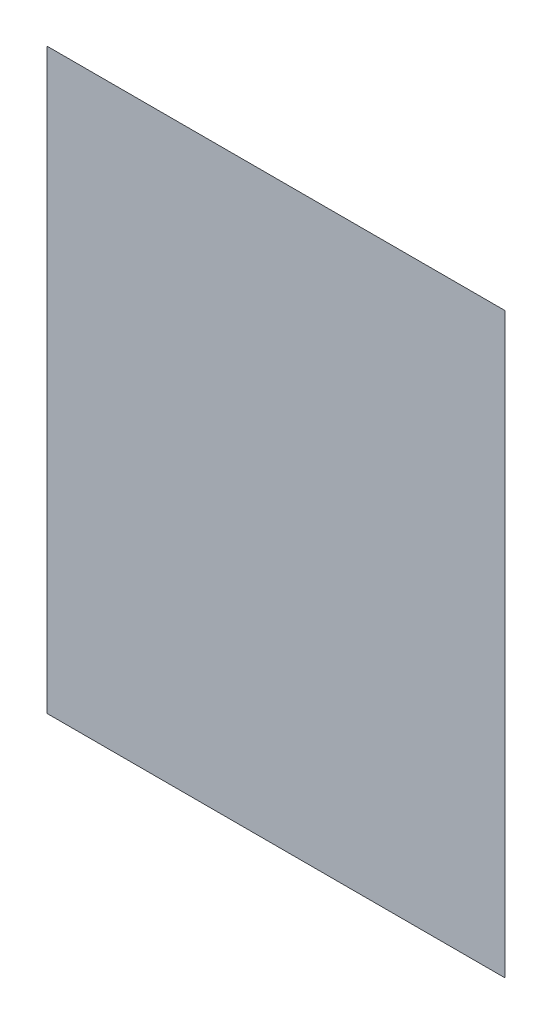
ISO-10303-21;
HEADER;
FILE_DESCRIPTION(('STEP AP214'),'2;1');
FILE_NAME('part.step','',(''),(''),'','','');
FILE_SCHEMA(('AUTOMOTIVE_DESIGN { 1 0 10303 214 1 1 1 1 }'));
ENDSEC;
DATA;
#1=APPLICATION_CONTEXT('core data for automotive mechanical design processes');
#2=APPLICATION_PROTOCOL_DEFINITION('international standard','automotive_design',2000,#1);
#3=PRODUCT_CONTEXT('',#1,'mechanical');
#4=PRODUCT('Part','Part','',(#3));
#5=PRODUCT_RELATED_PRODUCT_CATEGORY('part','',(#4));
#6=PRODUCT_DEFINITION_FORMATION('','',#4);
#7=PRODUCT_DEFINITION_CONTEXT('part definition',#1,'design');
#8=PRODUCT_DEFINITION('design','',#6,#7);
#9=PRODUCT_DEFINITION_SHAPE('','',#8);
#10=(LENGTH_UNIT() NAMED_UNIT(*) SI_UNIT(.MILLI.,.METRE.));
#11=(NAMED_UNIT(*) PLANE_ANGLE_UNIT() SI_UNIT($,.RADIAN.));
#12=(NAMED_UNIT(*) SI_UNIT($,.STERADIAN.) SOLID_ANGLE_UNIT());
#13=UNCERTAINTY_MEASURE_WITH_UNIT(LENGTH_MEASURE(1.E-05),#10,'distance_accuracy_value','');
#14=(GEOMETRIC_REPRESENTATION_CONTEXT(3) GLOBAL_UNCERTAINTY_ASSIGNED_CONTEXT((#13)) GLOBAL_UNIT_ASSIGNED_CONTEXT((#10,
#11,#12)) REPRESENTATION_CONTEXT('',''));
#15=CARTESIAN_POINT('',(0.,0.,0.));
#16=DIRECTION('',(0.,0.,1.));
#17=DIRECTION('',(1.,0.,0.));
#18=AXIS2_PLACEMENT_3D('',#15,#16,#17);
#19=CARTESIAN_POINT('',(47.,45.5,1.1596000001));
#20=DIRECTION('',(0.,0.,1.));
#21=DIRECTION('',(1.,0.,0.));
#22=AXIS2_PLACEMENT_3D('',#19,#20,#21);
#23=PLANE('',#22);
#24=CARTESIAN_POINT('',(46.425,44.775,1.1596000001));
#25=DIRECTION('',(1.,0.,0.));
#26=VECTOR('',#25,1.);
#27=LINE('',#24,#26);
#28=CARTESIAN_POINT('',(46.425,44.775,1.1595500001));
#29=VERTEX_POINT('',#28);
#30=CARTESIAN_POINT('',(47.575,44.775,1.1595500001));
#31=VERTEX_POINT('',#30);
#32=EDGE_CURVE('E49',#29,#31,#27,.T.);
#33=ORIENTED_EDGE('',*,*,#32,.T.);
#34=CARTESIAN_POINT('',(47.575,44.775,1.1596000001));
#35=DIRECTION('',(0.,1.,0.));
#36=VECTOR('',#35,1.);
#37=LINE('',#34,#36);
#38=CARTESIAN_POINT('',(47.575,46.225,1.1595500001));
#39=VERTEX_POINT('',#38);
#40=EDGE_CURVE('E57',#31,#39,#37,.T.);
#41=ORIENTED_EDGE('',*,*,#40,.T.);
#42=CARTESIAN_POINT('',(47.575,46.225,1.1596000001));
#43=DIRECTION('',(-1.,0.,0.));
#44=VECTOR('',#43,1.);
#45=LINE('',#42,#44);
#46=CARTESIAN_POINT('',(46.425,46.225,1.1595500001));
#47=VERTEX_POINT('',#46);
#48=EDGE_CURVE('E11',#39,#47,#45,.T.);
#49=ORIENTED_EDGE('',*,*,#48,.T.);
#50=CARTESIAN_POINT('',(46.425,46.225,1.1596000001));
#51=DIRECTION('',(0.,-1.,0.));
#52=VECTOR('',#51,1.);
#53=LINE('',#50,#52);
#54=EDGE_CURVE('E29',#47,#29,#53,.T.);
#55=ORIENTED_EDGE('',*,*,#54,.T.);
#56=EDGE_LOOP('',(#33,#41,#49,#55));
#57=FACE_BOUND('',#56,.T.);
#58=ADVANCED_FACE('F17',(#57),#23,.T.);
#59=CARTESIAN_POINT('',(47.,45.5,1.1595000001));
#60=DIRECTION('',(0.,0.,1.));
#61=DIRECTION('',(1.,0.,0.));
#62=AXIS2_PLACEMENT_3D('',#59,#60,#61);
#63=PLANE('',#62);
#64=ORIENTED_EDGE('',*,*,#40,.F.);
#65=ORIENTED_EDGE('',*,*,#32,.F.);
#66=ORIENTED_EDGE('',*,*,#54,.F.);
#67=ORIENTED_EDGE('',*,*,#48,.F.);
#68=EDGE_LOOP('',(#64,#65,#66,#67));
#69=FACE_BOUND('',#68,.T.);
#70=ADVANCED_FACE('F56',(#69),#63,.F.);
#71=CLOSED_SHELL('',(#58,#70));
#72=MANIFOLD_SOLID_BREP('B1',#71);
#73=ADVANCED_BREP_SHAPE_REPRESENTATION('',(#18,#72),#14);
#74=SHAPE_DEFINITION_REPRESENTATION(#9,#73);
ENDSEC;
END-ISO-10303-21;
